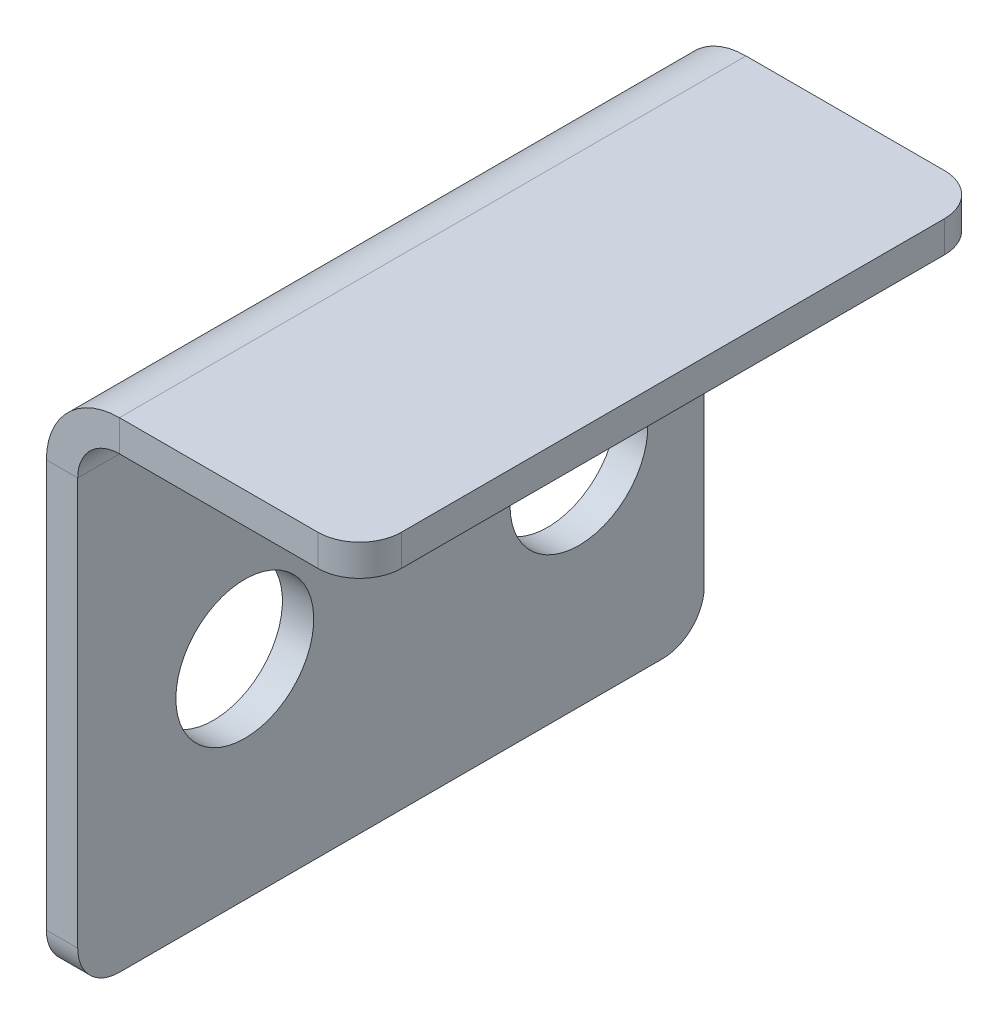
ISO-10303-21;
HEADER;
FILE_DESCRIPTION(('STEP AP214'),'2;1');
FILE_NAME('part.step','',(''),(''),'','','');
FILE_SCHEMA(('AUTOMOTIVE_DESIGN { 1 0 10303 214 1 1 1 1 }'));
ENDSEC;
DATA;
#1=APPLICATION_CONTEXT('core data for automotive mechanical design processes');
#2=APPLICATION_PROTOCOL_DEFINITION('international standard','automotive_design',2000,#1);
#3=PRODUCT_CONTEXT('',#1,'mechanical');
#4=PRODUCT('Part','Part','',(#3));
#5=PRODUCT_RELATED_PRODUCT_CATEGORY('part','',(#4));
#6=PRODUCT_DEFINITION_FORMATION('','',#4);
#7=PRODUCT_DEFINITION_CONTEXT('part definition',#1,'design');
#8=PRODUCT_DEFINITION('design','',#6,#7);
#9=PRODUCT_DEFINITION_SHAPE('','',#8);
#10=(LENGTH_UNIT() NAMED_UNIT(*) SI_UNIT(.MILLI.,.METRE.));
#11=(NAMED_UNIT(*) PLANE_ANGLE_UNIT() SI_UNIT($,.RADIAN.));
#12=(NAMED_UNIT(*) SI_UNIT($,.STERADIAN.) SOLID_ANGLE_UNIT());
#13=UNCERTAINTY_MEASURE_WITH_UNIT(LENGTH_MEASURE(1.E-05),#10,'distance_accuracy_value','');
#14=(GEOMETRIC_REPRESENTATION_CONTEXT(3) GLOBAL_UNCERTAINTY_ASSIGNED_CONTEXT((#13)) GLOBAL_UNIT_ASSIGNED_CONTEXT((#10,
#11,#12)) REPRESENTATION_CONTEXT('',''));
#15=CARTESIAN_POINT('',(0.,0.,0.));
#16=DIRECTION('',(0.,0.,1.));
#17=DIRECTION('',(1.,0.,0.));
#18=AXIS2_PLACEMENT_3D('',#15,#16,#17);
#19=CARTESIAN_POINT('',(3.5,0.,15.));
#20=DIRECTION('',(0.,0.,1.));
#21=DIRECTION('',(1.,0.,0.));
#22=AXIS2_PLACEMENT_3D('',#19,#20,#21);
#23=PLANE('',#22);
#24=DIRECTION('',(0.,-1.,0.));
#25=VECTOR('',#24,1.);
#26=CARTESIAN_POINT('',(3.5,0.,15.));
#27=LINE('',#26,#25);
#28=CARTESIAN_POINT('',(3.5,0.,15.));
#29=VERTEX_POINT('',#28);
#30=CARTESIAN_POINT('',(3.5,-1.5,15.));
#31=VERTEX_POINT('',#30);
#32=EDGE_CURVE('E128',#29,#31,#27,.T.);
#33=ORIENTED_EDGE('',*,*,#32,.F.);
#34=CARTESIAN_POINT('',(3.5,-3.5,15.));
#35=DIRECTION('',(0.,0.,1.));
#36=DIRECTION('',(1.,0.,0.));
#37=AXIS2_PLACEMENT_3D('',#34,#35,#36);
#38=CIRCLE('',#37,3.5);
#39=CARTESIAN_POINT('',(0.,-3.5,15.));
#40=VERTEX_POINT('',#39);
#41=EDGE_CURVE('E132',#40,#29,#38,.F.);
#42=ORIENTED_EDGE('',*,*,#41,.F.);
#43=DIRECTION('',(-1.,0.,0.));
#44=VECTOR('',#43,1.);
#45=CARTESIAN_POINT('',(1.5,-3.5,15.));
#46=LINE('',#45,#44);
#47=CARTESIAN_POINT('',(1.5,-3.5,15.));
#48=VERTEX_POINT('',#47);
#49=EDGE_CURVE('E137',#48,#40,#46,.T.);
#50=ORIENTED_EDGE('',*,*,#49,.F.);
#51=CARTESIAN_POINT('',(3.5,-3.5,15.));
#52=DIRECTION('',(0.,0.,1.));
#53=DIRECTION('',(1.,0.,0.));
#54=AXIS2_PLACEMENT_3D('',#51,#52,#53);
#55=CIRCLE('',#54,2.);
#56=EDGE_CURVE('E134',#48,#31,#55,.F.);
#57=ORIENTED_EDGE('',*,*,#56,.T.);
#58=EDGE_LOOP('',(#33,#42,#50,#57));
#59=FACE_BOUND('',#58,.T.);
#60=ADVANCED_FACE('F37',(#59),#23,.T.);
#61=CARTESIAN_POINT('',(1.5,-3.5,15.));
#62=DIRECTION('',(0.,0.,1.));
#63=DIRECTION('',(1.,0.,0.));
#64=AXIS2_PLACEMENT_3D('',#61,#62,#63);
#65=PLANE('',#64);
#66=DIRECTION('',(1.,0.,0.));
#67=VECTOR('',#66,1.);
#68=CARTESIAN_POINT('',(0.,-1.5,15.));
#69=LINE('',#68,#67);
#70=CARTESIAN_POINT('',(13.,-1.5,15.));
#71=VERTEX_POINT('',#70);
#72=EDGE_CURVE('E155',#31,#71,#69,.T.);
#73=ORIENTED_EDGE('',*,*,#72,.T.);
#74=DIRECTION('',(0.,-1.,0.));
#75=VECTOR('',#74,1.);
#76=CARTESIAN_POINT('',(13.,-3.5,15.));
#77=LINE('',#76,#75);
#78=CARTESIAN_POINT('',(13.,0.,15.));
#79=VERTEX_POINT('',#78);
#80=EDGE_CURVE('E11',#71,#79,#77,.F.);
#81=ORIENTED_EDGE('',*,*,#80,.T.);
#82=DIRECTION('',(1.,0.,0.));
#83=VECTOR('',#82,1.);
#84=CARTESIAN_POINT('',(0.,0.,15.));
#85=LINE('',#84,#83);
#86=EDGE_CURVE('E144',#29,#79,#85,.T.);
#87=ORIENTED_EDGE('',*,*,#86,.F.);
#88=ORIENTED_EDGE('',*,*,#32,.T.);
#89=EDGE_LOOP('',(#73,#81,#87,#88));
#90=FACE_BOUND('',#89,.T.);
#91=ADVANCED_FACE('F154',(#90),#65,.T.);
#92=CARTESIAN_POINT('',(0.,-3.5,-15.));
#93=DIRECTION('',(0.,0.,-1.));
#94=DIRECTION('',(-1.,0.,0.));
#95=AXIS2_PLACEMENT_3D('',#92,#93,#94);
#96=PLANE('',#95);
#97=DIRECTION('',(1.,0.,0.));
#98=VECTOR('',#97,1.);
#99=CARTESIAN_POINT('',(0.,-3.5,-15.));
#100=LINE('',#99,#98);
#101=CARTESIAN_POINT('',(0.,-3.5,-15.));
#102=VERTEX_POINT('',#101);
#103=CARTESIAN_POINT('',(1.5,-3.5,-15.));
#104=VERTEX_POINT('',#103);
#105=EDGE_CURVE('E200',#102,#104,#100,.T.);
#106=ORIENTED_EDGE('',*,*,#105,.F.);
#107=CARTESIAN_POINT('',(3.5,-3.5,-15.));
#108=DIRECTION('',(0.,0.,1.));
#109=DIRECTION('',(1.,0.,0.));
#110=AXIS2_PLACEMENT_3D('',#107,#108,#109);
#111=CIRCLE('',#110,3.5);
#112=CARTESIAN_POINT('',(3.5,0.,-15.));
#113=VERTEX_POINT('',#112);
#114=EDGE_CURVE('E174',#102,#113,#111,.F.);
#115=ORIENTED_EDGE('',*,*,#114,.T.);
#116=DIRECTION('',(0.,1.,0.));
#117=VECTOR('',#116,1.);
#118=CARTESIAN_POINT('',(3.5,-1.5,-15.));
#119=LINE('',#118,#117);
#120=CARTESIAN_POINT('',(3.5,-1.5,-15.));
#121=VERTEX_POINT('',#120);
#122=EDGE_CURVE('E198',#121,#113,#119,.T.);
#123=ORIENTED_EDGE('',*,*,#122,.F.);
#124=CARTESIAN_POINT('',(3.5,-3.5,-15.));
#125=DIRECTION('',(0.,0.,1.));
#126=DIRECTION('',(1.,0.,0.));
#127=AXIS2_PLACEMENT_3D('',#124,#125,#126);
#128=CIRCLE('',#127,2.);
#129=EDGE_CURVE('E180',#104,#121,#128,.F.);
#130=ORIENTED_EDGE('',*,*,#129,.F.);
#131=EDGE_LOOP('',(#106,#115,#123,#130));
#132=FACE_BOUND('',#131,.T.);
#133=ADVANCED_FACE('F294',(#132),#96,.T.);
#134=CARTESIAN_POINT('',(3.5,-1.5,-15.));
#135=DIRECTION('',(0.,0.,-1.));
#136=DIRECTION('',(-1.,0.,0.));
#137=AXIS2_PLACEMENT_3D('',#134,#135,#136);
#138=PLANE('',#137);
#139=DIRECTION('',(0.,1.,0.));
#140=VECTOR('',#139,1.);
#141=CARTESIAN_POINT('',(1.5,0.,-15.));
#142=LINE('',#141,#140);
#143=CARTESIAN_POINT('',(1.5,-23.,-15.));
#144=VERTEX_POINT('',#143);
#145=EDGE_CURVE('E178',#144,#104,#142,.T.);
#146=ORIENTED_EDGE('',*,*,#145,.F.);
#147=DIRECTION('',(-1.,0.,0.));
#148=VECTOR('',#147,1.);
#149=CARTESIAN_POINT('',(3.5,-23.,-15.));
#150=LINE('',#149,#148);
#151=CARTESIAN_POINT('',(0.,-23.,-15.));
#152=VERTEX_POINT('',#151);
#153=EDGE_CURVE('E222',#144,#152,#150,.T.);
#154=ORIENTED_EDGE('',*,*,#153,.T.);
#155=DIRECTION('',(0.,1.,0.));
#156=VECTOR('',#155,1.);
#157=CARTESIAN_POINT('',(0.,0.,-15.));
#158=LINE('',#157,#156);
#159=EDGE_CURVE('E176',#152,#102,#158,.T.);
#160=ORIENTED_EDGE('',*,*,#159,.T.);
#161=ORIENTED_EDGE('',*,*,#105,.T.);
#162=EDGE_LOOP('',(#146,#154,#160,#161));
#163=FACE_BOUND('',#162,.T.);
#164=ADVANCED_FACE('F288',(#163),#138,.T.);
#165=CARTESIAN_POINT('',(0.,-1.5,15.));
#166=DIRECTION('',(0.,1.,0.));
#167=DIRECTION('',(0.,0.,1.));
#168=AXIS2_PLACEMENT_3D('',#165,#166,#167);
#169=PLANE('',#168);
#170=DIRECTION('',(1.,0.,0.));
#171=VECTOR('',#170,1.);
#172=CARTESIAN_POINT('',(0.,-1.5,-15.));
#173=LINE('',#172,#171);
#174=CARTESIAN_POINT('',(13.,-1.5,-15.));
#175=VERTEX_POINT('',#174);
#176=EDGE_CURVE('E169',#121,#175,#173,.T.);
#177=ORIENTED_EDGE('',*,*,#176,.T.);
#178=CARTESIAN_POINT('',(13.,-1.5,-13.));
#179=DIRECTION('',(0.,1.,0.));
#180=DIRECTION('',(0.,0.,1.));
#181=AXIS2_PLACEMENT_3D('',#178,#179,#180);
#182=CIRCLE('',#181,2.);
#183=CARTESIAN_POINT('',(15.,-1.5,-13.));
#184=VERTEX_POINT('',#183);
#185=EDGE_CURVE('E230',#175,#184,#182,.F.);
#186=ORIENTED_EDGE('',*,*,#185,.T.);
#187=DIRECTION('',(0.,0.,-1.));
#188=VECTOR('',#187,1.);
#189=CARTESIAN_POINT('',(15.,-1.5,15.));
#190=LINE('',#189,#188);
#191=CARTESIAN_POINT('',(15.,-1.5,13.));
#192=VERTEX_POINT('',#191);
#193=EDGE_CURVE('E196',#192,#184,#190,.T.);
#194=ORIENTED_EDGE('',*,*,#193,.F.);
#195=CARTESIAN_POINT('',(13.,-1.5,13.));
#196=DIRECTION('',(0.,1.,0.));
#197=DIRECTION('',(0.,0.,1.));
#198=AXIS2_PLACEMENT_3D('',#195,#196,#197);
#199=CIRCLE('',#198,2.);
#200=EDGE_CURVE('E228',#192,#71,#199,.F.);
#201=ORIENTED_EDGE('',*,*,#200,.T.);
#202=ORIENTED_EDGE('',*,*,#72,.F.);
#203=DIRECTION('',(0.,0.,-1.));
#204=VECTOR('',#203,1.);
#205=CARTESIAN_POINT('',(3.5,-1.5,15.));
#206=LINE('',#205,#204);
#207=EDGE_CURVE('E168',#31,#121,#206,.T.);
#208=ORIENTED_EDGE('',*,*,#207,.T.);
#209=EDGE_LOOP('',(#177,#186,#194,#201,#202,#208));
#210=FACE_BOUND('',#209,.T.);
#211=ADVANCED_FACE('F246',(#210),#169,.F.);
#212=CARTESIAN_POINT('',(15.,0.,15.));
#213=DIRECTION('',(1.,0.,0.));
#214=DIRECTION('',(0.,0.,-1.));
#215=AXIS2_PLACEMENT_3D('',#212,#213,#214);
#216=PLANE('',#215);
#217=ORIENTED_EDGE('',*,*,#193,.T.);
#218=DIRECTION('',(0.,-1.,0.));
#219=VECTOR('',#218,1.);
#220=CARTESIAN_POINT('',(15.,0.,-13.));
#221=LINE('',#220,#219);
#222=CARTESIAN_POINT('',(15.,0.,-13.));
#223=VERTEX_POINT('',#222);
#224=EDGE_CURVE('E58',#184,#223,#221,.F.);
#225=ORIENTED_EDGE('',*,*,#224,.T.);
#226=DIRECTION('',(0.,0.,-1.));
#227=VECTOR('',#226,1.);
#228=CARTESIAN_POINT('',(15.,0.,15.));
#229=LINE('',#228,#227);
#230=CARTESIAN_POINT('',(15.,0.,13.));
#231=VERTEX_POINT('',#230);
#232=EDGE_CURVE('E151',#231,#223,#229,.T.);
#233=ORIENTED_EDGE('',*,*,#232,.F.);
#234=DIRECTION('',(0.,-1.,0.));
#235=VECTOR('',#234,1.);
#236=CARTESIAN_POINT('',(15.,0.,13.));
#237=LINE('',#236,#235);
#238=EDGE_CURVE('E232',#231,#192,#237,.T.);
#239=ORIENTED_EDGE('',*,*,#238,.T.);
#240=EDGE_LOOP('',(#217,#225,#233,#239));
#241=FACE_BOUND('',#240,.T.);
#242=ADVANCED_FACE('F247',(#241),#216,.T.);
#243=CARTESIAN_POINT('',(0.,0.,15.));
#244=DIRECTION('',(0.,1.,0.));
#245=DIRECTION('',(0.,0.,1.));
#246=AXIS2_PLACEMENT_3D('',#243,#244,#245);
#247=PLANE('',#246);
#248=ORIENTED_EDGE('',*,*,#232,.T.);
#249=CARTESIAN_POINT('',(13.,0.,-13.));
#250=DIRECTION('',(0.,1.,0.));
#251=DIRECTION('',(0.,0.,1.));
#252=AXIS2_PLACEMENT_3D('',#249,#250,#251);
#253=CIRCLE('',#252,2.);
#254=CARTESIAN_POINT('',(13.,0.,-15.));
#255=VERTEX_POINT('',#254);
#256=EDGE_CURVE('E45',#223,#255,#253,.T.);
#257=ORIENTED_EDGE('',*,*,#256,.T.);
#258=DIRECTION('',(1.,0.,0.));
#259=VECTOR('',#258,1.);
#260=CARTESIAN_POINT('',(0.,0.,-15.));
#261=LINE('',#260,#259);
#262=EDGE_CURVE('E147',#113,#255,#261,.T.);
#263=ORIENTED_EDGE('',*,*,#262,.F.);
#264=DIRECTION('',(0.,0.,-1.));
#265=VECTOR('',#264,1.);
#266=CARTESIAN_POINT('',(3.5,0.,15.));
#267=LINE('',#266,#265);
#268=EDGE_CURVE('E142',#29,#113,#267,.T.);
#269=ORIENTED_EDGE('',*,*,#268,.F.);
#270=ORIENTED_EDGE('',*,*,#86,.T.);
#271=CARTESIAN_POINT('',(13.,0.,13.));
#272=DIRECTION('',(0.,1.,0.));
#273=DIRECTION('',(0.,0.,1.));
#274=AXIS2_PLACEMENT_3D('',#271,#272,#273);
#275=CIRCLE('',#274,2.);
#276=EDGE_CURVE('E236',#79,#231,#275,.T.);
#277=ORIENTED_EDGE('',*,*,#276,.T.);
#278=EDGE_LOOP('',(#248,#257,#263,#269,#270,#277));
#279=FACE_BOUND('',#278,.T.);
#280=ADVANCED_FACE('F143',(#279),#247,.T.);
#281=CARTESIAN_POINT('',(3.5,-3.5,15.));
#282=DIRECTION('',(0.,0.,-1.));
#283=DIRECTION('',(-1.,0.,0.));
#284=AXIS2_PLACEMENT_3D('',#281,#282,#283);
#285=CYLINDRICAL_SURFACE('',#284,3.5);
#286=ORIENTED_EDGE('',*,*,#114,.F.);
#287=DIRECTION('',(0.,0.,-1.));
#288=VECTOR('',#287,1.);
#289=CARTESIAN_POINT('',(0.,-3.5,15.));
#290=LINE('',#289,#288);
#291=EDGE_CURVE('E152',#40,#102,#290,.T.);
#292=ORIENTED_EDGE('',*,*,#291,.F.);
#293=ORIENTED_EDGE('',*,*,#41,.T.);
#294=ORIENTED_EDGE('',*,*,#268,.T.);
#295=EDGE_LOOP('',(#286,#292,#293,#294));
#296=FACE_BOUND('',#295,.T.);
#297=ADVANCED_FACE('F158',(#296),#285,.T.);
#298=CARTESIAN_POINT('',(0.,0.,15.));
#299=DIRECTION('',(-1.,0.,0.));
#300=DIRECTION('',(0.,-1.,0.));
#301=AXIS2_PLACEMENT_3D('',#298,#299,#300);
#302=PLANE('',#301);
#303=CARTESIAN_POINT('',(0.,-15.,-9.));
#304=DIRECTION('',(-1.,0.,0.));
#305=DIRECTION('',(0.,0.,1.));
#306=AXIS2_PLACEMENT_3D('',#303,#304,#305);
#307=CIRCLE('',#306,3.3);
#308=CARTESIAN_POINT('',(0.,-15.,-5.7));
#309=VERTEX_POINT('',#308);
#310=EDGE_CURVE('E257',#309,#309,#307,.T.);
#311=ORIENTED_EDGE('',*,*,#310,.F.);
#312=EDGE_LOOP('',(#311));
#313=FACE_BOUND('',#312,.T.);
#314=CARTESIAN_POINT('',(0.,-15.,7.));
#315=DIRECTION('',(-1.,0.,0.));
#316=DIRECTION('',(0.,0.,1.));
#317=AXIS2_PLACEMENT_3D('',#314,#315,#316);
#318=CIRCLE('',#317,3.3);
#319=CARTESIAN_POINT('',(0.,-15.,10.3));
#320=VERTEX_POINT('',#319);
#321=EDGE_CURVE('E207',#320,#320,#318,.T.);
#322=ORIENTED_EDGE('',*,*,#321,.F.);
#323=EDGE_LOOP('',(#322));
#324=FACE_BOUND('',#323,.T.);
#325=DIRECTION('',(0.,0.,-1.));
#326=VECTOR('',#325,1.);
#327=CARTESIAN_POINT('',(0.,-25.,15.));
#328=LINE('',#327,#326);
#329=CARTESIAN_POINT('',(0.,-25.,13.));
#330=VERTEX_POINT('',#329);
#331=CARTESIAN_POINT('',(0.,-25.,-13.));
#332=VERTEX_POINT('',#331);
#333=EDGE_CURVE('E191',#330,#332,#328,.T.);
#334=ORIENTED_EDGE('',*,*,#333,.F.);
#335=CARTESIAN_POINT('',(0.,-23.,13.));
#336=DIRECTION('',(-1.,0.,0.));
#337=DIRECTION('',(0.,-1.,0.));
#338=AXIS2_PLACEMENT_3D('',#335,#336,#337);
#339=CIRCLE('',#338,2.);
#340=CARTESIAN_POINT('',(0.,-23.,15.));
#341=VERTEX_POINT('',#340);
#342=EDGE_CURVE('E214',#330,#341,#339,.T.);
#343=ORIENTED_EDGE('',*,*,#342,.T.);
#344=DIRECTION('',(0.,1.,0.));
#345=VECTOR('',#344,1.);
#346=CARTESIAN_POINT('',(0.,0.,15.));
#347=LINE('',#346,#345);
#348=EDGE_CURVE('E160',#341,#40,#347,.T.);
#349=ORIENTED_EDGE('',*,*,#348,.T.);
#350=ORIENTED_EDGE('',*,*,#291,.T.);
#351=ORIENTED_EDGE('',*,*,#159,.F.);
#352=CARTESIAN_POINT('',(0.,-23.,-13.));
#353=DIRECTION('',(-1.,0.,0.));
#354=DIRECTION('',(0.,-1.,0.));
#355=AXIS2_PLACEMENT_3D('',#352,#353,#354);
#356=CIRCLE('',#355,2.);
#357=EDGE_CURVE('E212',#152,#332,#356,.T.);
#358=ORIENTED_EDGE('',*,*,#357,.T.);
#359=EDGE_LOOP('',(#334,#343,#349,#350,#351,#358));
#360=FACE_BOUND('',#359,.T.);
#361=ADVANCED_FACE('F264',(#313,#324,#360),#302,.T.);
#362=CARTESIAN_POINT('',(1.5,-25.,15.));
#363=DIRECTION('',(0.,-1.,0.));
#364=DIRECTION('',(0.,0.,-1.));
#365=AXIS2_PLACEMENT_3D('',#362,#363,#364);
#366=PLANE('',#365);
#367=DIRECTION('',(0.,0.,-1.));
#368=VECTOR('',#367,1.);
#369=CARTESIAN_POINT('',(1.5,-25.,15.));
#370=LINE('',#369,#368);
#371=CARTESIAN_POINT('',(1.5,-25.,13.));
#372=VERTEX_POINT('',#371);
#373=CARTESIAN_POINT('',(1.5,-25.,-13.));
#374=VERTEX_POINT('',#373);
#375=EDGE_CURVE('E188',#372,#374,#370,.T.);
#376=ORIENTED_EDGE('',*,*,#375,.F.);
#377=DIRECTION('',(-1.,0.,0.));
#378=VECTOR('',#377,1.);
#379=CARTESIAN_POINT('',(1.5,-25.,13.));
#380=LINE('',#379,#378);
#381=EDGE_CURVE('E209',#372,#330,#380,.T.);
#382=ORIENTED_EDGE('',*,*,#381,.T.);
#383=ORIENTED_EDGE('',*,*,#333,.T.);
#384=DIRECTION('',(-1.,0.,0.));
#385=VECTOR('',#384,1.);
#386=CARTESIAN_POINT('',(1.5,-25.,-13.));
#387=LINE('',#386,#385);
#388=EDGE_CURVE('E136',#332,#374,#387,.F.);
#389=ORIENTED_EDGE('',*,*,#388,.T.);
#390=EDGE_LOOP('',(#376,#382,#383,#389));
#391=FACE_BOUND('',#390,.T.);
#392=ADVANCED_FACE('F267',(#391),#366,.T.);
#393=CARTESIAN_POINT('',(1.5,0.,15.));
#394=DIRECTION('',(-1.,0.,0.));
#395=DIRECTION('',(0.,-1.,0.));
#396=AXIS2_PLACEMENT_3D('',#393,#394,#395);
#397=PLANE('',#396);
#398=CARTESIAN_POINT('',(1.5,-15.,-9.));
#399=DIRECTION('',(-1.,0.,0.));
#400=DIRECTION('',(0.,-1.,0.));
#401=AXIS2_PLACEMENT_3D('',#398,#399,#400);
#402=CIRCLE('',#401,3.3);
#403=CARTESIAN_POINT('',(1.5,-18.3,-9.));
#404=VERTEX_POINT('',#403);
#405=EDGE_CURVE('E254',#404,#404,#402,.T.);
#406=ORIENTED_EDGE('',*,*,#405,.T.);
#407=EDGE_LOOP('',(#406));
#408=FACE_BOUND('',#407,.T.);
#409=CARTESIAN_POINT('',(1.5,-15.,7.));
#410=DIRECTION('',(-1.,0.,0.));
#411=DIRECTION('',(0.,-1.,0.));
#412=AXIS2_PLACEMENT_3D('',#409,#410,#411);
#413=CIRCLE('',#412,3.3);
#414=CARTESIAN_POINT('',(1.5,-18.3,7.));
#415=VERTEX_POINT('',#414);
#416=EDGE_CURVE('E172',#415,#415,#413,.T.);
#417=ORIENTED_EDGE('',*,*,#416,.T.);
#418=EDGE_LOOP('',(#417));
#419=FACE_BOUND('',#418,.T.);
#420=DIRECTION('',(0.,1.,0.));
#421=VECTOR('',#420,1.);
#422=CARTESIAN_POINT('',(1.5,0.,15.));
#423=LINE('',#422,#421);
#424=CARTESIAN_POINT('',(1.5,-23.,15.));
#425=VERTEX_POINT('',#424);
#426=EDGE_CURVE('E162',#425,#48,#423,.T.);
#427=ORIENTED_EDGE('',*,*,#426,.F.);
#428=CARTESIAN_POINT('',(1.5,-23.,13.));
#429=DIRECTION('',(-1.,0.,0.));
#430=DIRECTION('',(0.,-1.,0.));
#431=AXIS2_PLACEMENT_3D('',#428,#429,#430);
#432=CIRCLE('',#431,2.);
#433=EDGE_CURVE('E220',#425,#372,#432,.F.);
#434=ORIENTED_EDGE('',*,*,#433,.T.);
#435=ORIENTED_EDGE('',*,*,#375,.T.);
#436=CARTESIAN_POINT('',(1.5,-23.,-13.));
#437=DIRECTION('',(-1.,0.,0.));
#438=DIRECTION('',(0.,-1.,0.));
#439=AXIS2_PLACEMENT_3D('',#436,#437,#438);
#440=CIRCLE('',#439,2.);
#441=EDGE_CURVE('E218',#374,#144,#440,.F.);
#442=ORIENTED_EDGE('',*,*,#441,.T.);
#443=ORIENTED_EDGE('',*,*,#145,.T.);
#444=DIRECTION('',(0.,0.,-1.));
#445=VECTOR('',#444,1.);
#446=CARTESIAN_POINT('',(1.5,-3.5,15.));
#447=LINE('',#446,#445);
#448=EDGE_CURVE('E185',#48,#104,#447,.T.);
#449=ORIENTED_EDGE('',*,*,#448,.F.);
#450=EDGE_LOOP('',(#427,#434,#435,#442,#443,#449));
#451=FACE_BOUND('',#450,.T.);
#452=ADVANCED_FACE('F285',(#408,#419,#451),#397,.F.);
#453=CARTESIAN_POINT('',(3.5,-3.5,15.));
#454=DIRECTION('',(0.,0.,-1.));
#455=DIRECTION('',(-1.,0.,0.));
#456=AXIS2_PLACEMENT_3D('',#453,#454,#455);
#457=CYLINDRICAL_SURFACE('',#456,2.);
#458=ORIENTED_EDGE('',*,*,#129,.T.);
#459=ORIENTED_EDGE('',*,*,#207,.F.);
#460=ORIENTED_EDGE('',*,*,#56,.F.);
#461=ORIENTED_EDGE('',*,*,#448,.T.);
#462=EDGE_LOOP('',(#458,#459,#460,#461));
#463=FACE_BOUND('',#462,.T.);
#464=ADVANCED_FACE('F293',(#463),#457,.F.);
#465=CARTESIAN_POINT('',(3.5,-3.5,15.));
#466=DIRECTION('',(0.,0.,1.));
#467=DIRECTION('',(1.,0.,0.));
#468=AXIS2_PLACEMENT_3D('',#465,#466,#467);
#469=PLANE('',#468);
#470=ORIENTED_EDGE('',*,*,#348,.F.);
#471=DIRECTION('',(-1.,0.,0.));
#472=VECTOR('',#471,1.);
#473=CARTESIAN_POINT('',(3.5,-23.,15.));
#474=LINE('',#473,#472);
#475=EDGE_CURVE('E216',#341,#425,#474,.F.);
#476=ORIENTED_EDGE('',*,*,#475,.T.);
#477=ORIENTED_EDGE('',*,*,#426,.T.);
#478=ORIENTED_EDGE('',*,*,#49,.T.);
#479=EDGE_LOOP('',(#470,#476,#477,#478));
#480=FACE_BOUND('',#479,.T.);
#481=ADVANCED_FACE('F347',(#480),#469,.T.);
#482=CARTESIAN_POINT('',(3.5,-3.5,-15.));
#483=DIRECTION('',(0.,0.,1.));
#484=DIRECTION('',(1.,0.,0.));
#485=AXIS2_PLACEMENT_3D('',#482,#483,#484);
#486=PLANE('',#485);
#487=ORIENTED_EDGE('',*,*,#262,.T.);
#488=DIRECTION('',(0.,-1.,0.));
#489=VECTOR('',#488,1.);
#490=CARTESIAN_POINT('',(13.,-1.5,-15.));
#491=LINE('',#490,#489);
#492=EDGE_CURVE('E225',#255,#175,#491,.T.);
#493=ORIENTED_EDGE('',*,*,#492,.T.);
#494=ORIENTED_EDGE('',*,*,#176,.F.);
#495=ORIENTED_EDGE('',*,*,#122,.T.);
#496=EDGE_LOOP('',(#487,#493,#494,#495));
#497=FACE_BOUND('',#496,.T.);
#498=ADVANCED_FACE('F241',(#497),#486,.F.);
#499=CARTESIAN_POINT('',(0.,-15.,7.));
#500=DIRECTION('',(-1.,0.,0.));
#501=DIRECTION('',(0.,0.,1.));
#502=AXIS2_PLACEMENT_3D('',#499,#500,#501);
#503=CYLINDRICAL_SURFACE('',#502,3.3);
#504=ORIENTED_EDGE('',*,*,#321,.T.);
#505=EDGE_LOOP('',(#504));
#506=FACE_BOUND('',#505,.T.);
#507=ORIENTED_EDGE('',*,*,#416,.F.);
#508=EDGE_LOOP('',(#507));
#509=FACE_BOUND('',#508,.T.);
#510=ADVANCED_FACE('F346',(#506,#509),#503,.F.);
#511=CARTESIAN_POINT('',(0.,-15.,-9.));
#512=DIRECTION('',(-1.,0.,0.));
#513=DIRECTION('',(0.,0.,1.));
#514=AXIS2_PLACEMENT_3D('',#511,#512,#513);
#515=CYLINDRICAL_SURFACE('',#514,3.3);
#516=ORIENTED_EDGE('',*,*,#310,.T.);
#517=EDGE_LOOP('',(#516));
#518=FACE_BOUND('',#517,.T.);
#519=ORIENTED_EDGE('',*,*,#405,.F.);
#520=EDGE_LOOP('',(#519));
#521=FACE_BOUND('',#520,.T.);
#522=ADVANCED_FACE('F261',(#518,#521),#515,.F.);
#523=CARTESIAN_POINT('',(1.5,-23.,13.));
#524=DIRECTION('',(-1.,0.,0.));
#525=DIRECTION('',(0.,0.,1.));
#526=AXIS2_PLACEMENT_3D('',#523,#524,#525);
#527=CYLINDRICAL_SURFACE('',#526,2.);
#528=ORIENTED_EDGE('',*,*,#433,.F.);
#529=ORIENTED_EDGE('',*,*,#475,.F.);
#530=ORIENTED_EDGE('',*,*,#342,.F.);
#531=ORIENTED_EDGE('',*,*,#381,.F.);
#532=EDGE_LOOP('',(#528,#529,#530,#531));
#533=FACE_BOUND('',#532,.T.);
#534=ADVANCED_FACE('F308',(#533),#527,.T.);
#535=CARTESIAN_POINT('',(3.5,-23.,-13.));
#536=DIRECTION('',(-1.,0.,0.));
#537=DIRECTION('',(0.,0.,1.));
#538=AXIS2_PLACEMENT_3D('',#535,#536,#537);
#539=CYLINDRICAL_SURFACE('',#538,2.);
#540=ORIENTED_EDGE('',*,*,#441,.F.);
#541=ORIENTED_EDGE('',*,*,#388,.F.);
#542=ORIENTED_EDGE('',*,*,#357,.F.);
#543=ORIENTED_EDGE('',*,*,#153,.F.);
#544=EDGE_LOOP('',(#540,#541,#542,#543));
#545=FACE_BOUND('',#544,.T.);
#546=ADVANCED_FACE('F280',(#545),#539,.T.);
#547=CARTESIAN_POINT('',(13.,-3.5,-13.));
#548=DIRECTION('',(0.,1.,0.));
#549=DIRECTION('',(0.,0.,1.));
#550=AXIS2_PLACEMENT_3D('',#547,#548,#549);
#551=CYLINDRICAL_SURFACE('',#550,2.);
#552=ORIENTED_EDGE('',*,*,#256,.F.);
#553=ORIENTED_EDGE('',*,*,#224,.F.);
#554=ORIENTED_EDGE('',*,*,#185,.F.);
#555=ORIENTED_EDGE('',*,*,#492,.F.);
#556=EDGE_LOOP('',(#552,#553,#554,#555));
#557=FACE_BOUND('',#556,.T.);
#558=ADVANCED_FACE('F243',(#557),#551,.T.);
#559=CARTESIAN_POINT('',(13.,0.,13.));
#560=DIRECTION('',(0.,-1.,0.));
#561=DIRECTION('',(0.,0.,-1.));
#562=AXIS2_PLACEMENT_3D('',#559,#560,#561);
#563=CYLINDRICAL_SURFACE('',#562,2.);
#564=ORIENTED_EDGE('',*,*,#276,.F.);
#565=ORIENTED_EDGE('',*,*,#80,.F.);
#566=ORIENTED_EDGE('',*,*,#200,.F.);
#567=ORIENTED_EDGE('',*,*,#238,.F.);
#568=EDGE_LOOP('',(#564,#565,#566,#567));
#569=FACE_BOUND('',#568,.T.);
#570=ADVANCED_FACE('F39',(#569),#563,.T.);
#571=CLOSED_SHELL('',(#60,#91,#133,#164,#211,#242,#280,#297,#361,#392,#452,#464,#481,#498,#510,
#522,#534,#546,#558,#570));
#572=MANIFOLD_SOLID_BREP('B2',#571);
#573=ADVANCED_BREP_SHAPE_REPRESENTATION('',(#18,#572),#14);
#574=SHAPE_DEFINITION_REPRESENTATION(#9,#573);
ENDSEC;
END-ISO-10303-21;
